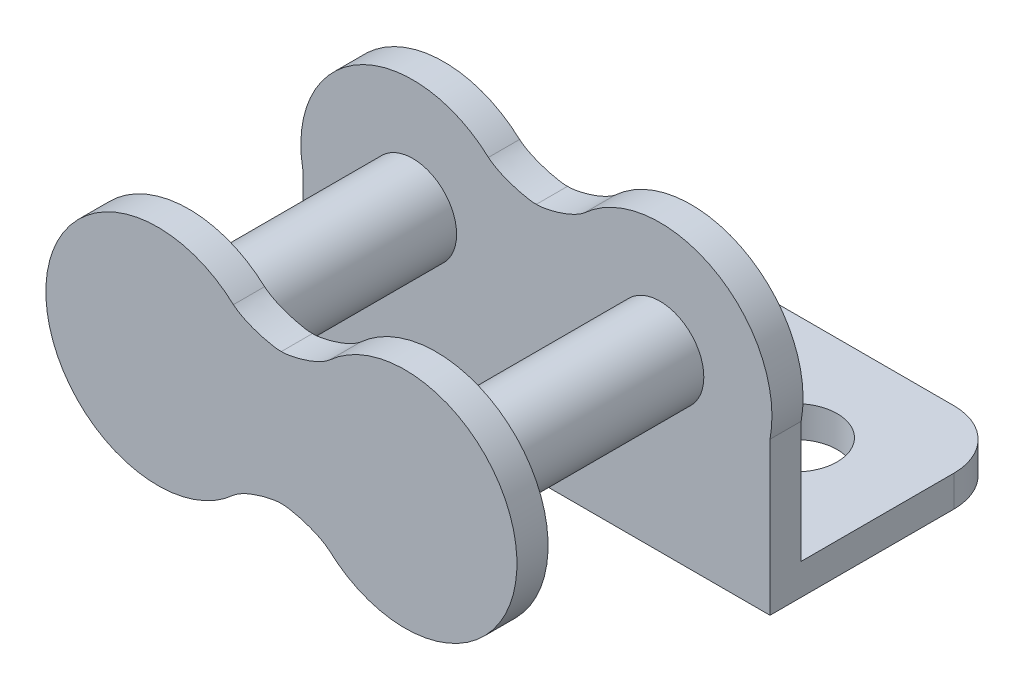
ISO-10303-21;
HEADER;
FILE_DESCRIPTION(('STEP AP214'),'2;1');
FILE_NAME('part.step','',(''),(''),'','','');
FILE_SCHEMA(('AUTOMOTIVE_DESIGN { 1 0 10303 214 1 1 1 1 }'));
ENDSEC;
DATA;
#1=APPLICATION_CONTEXT('core data for automotive mechanical design processes');
#2=APPLICATION_PROTOCOL_DEFINITION('international standard','automotive_design',2000,#1);
#3=PRODUCT_CONTEXT('',#1,'mechanical');
#4=PRODUCT('Part','Part','',(#3));
#5=PRODUCT_RELATED_PRODUCT_CATEGORY('part','',(#4));
#6=PRODUCT_DEFINITION_FORMATION('','',#4);
#7=PRODUCT_DEFINITION_CONTEXT('part definition',#1,'design');
#8=PRODUCT_DEFINITION('design','',#6,#7);
#9=PRODUCT_DEFINITION_SHAPE('','',#8);
#10=(LENGTH_UNIT() NAMED_UNIT(*) SI_UNIT(.MILLI.,.METRE.));
#11=(NAMED_UNIT(*) PLANE_ANGLE_UNIT() SI_UNIT($,.RADIAN.));
#12=(NAMED_UNIT(*) SI_UNIT($,.STERADIAN.) SOLID_ANGLE_UNIT());
#13=UNCERTAINTY_MEASURE_WITH_UNIT(LENGTH_MEASURE(1.E-05),#10,'distance_accuracy_value','');
#14=(GEOMETRIC_REPRESENTATION_CONTEXT(3) GLOBAL_UNCERTAINTY_ASSIGNED_CONTEXT((#13)) GLOBAL_UNIT_ASSIGNED_CONTEXT((#10,
#11,#12)) REPRESENTATION_CONTEXT('',''));
#15=CARTESIAN_POINT('',(0.,0.,0.));
#16=DIRECTION('',(0.,0.,1.));
#17=DIRECTION('',(1.,0.,0.));
#18=AXIS2_PLACEMENT_3D('',#15,#16,#17);
#19=CARTESIAN_POINT('',(0.,0.,4.45));
#20=DIRECTION('',(0.,0.,1.));
#21=DIRECTION('',(1.,0.,0.));
#22=AXIS2_PLACEMENT_3D('',#19,#20,#21);
#23=PLANE('',#22);
#24=CARTESIAN_POINT('',(-6.34999999999999,0.,4.45));
#25=DIRECTION('',(0.,0.,1.));
#26=DIRECTION('',(1.,0.,0.));
#27=AXIS2_PLACEMENT_3D('',#24,#25,#26);
#28=CIRCLE('',#27,5.75);
#29=CARTESIAN_POINT('',(-2.46452218888914,4.23858020796649,4.45));
#30=VERTEX_POINT('',#29);
#31=CARTESIAN_POINT('',(-2.46452218888914,-4.23858020796649,4.45));
#32=VERTEX_POINT('',#31);
#33=EDGE_CURVE('E259',#30,#32,#28,.T.);
#34=ORIENTED_EDGE('',*,*,#33,.F.);
#35=CARTESIAN_POINT('',(-2.46452218888914,4.23858020796649,4.45));
#36=CARTESIAN_POINT('',(-1.80114730329289,3.67793909032685,4.45));
#37=CARTESIAN_POINT('',(-0.37079064444816,3.34588107002075,4.45));
#38=CARTESIAN_POINT('',(0.,3.3863509377361,4.45));
#39=B_SPLINE_CURVE_WITH_KNOTS('',3,(#35,#36,#37,#38),.UNSPECIFIED.,.F.,.F.,(4,4),(0.,1.),.UNSPECIFIED.);
#40=CARTESIAN_POINT('',(0.,3.3863509377361,4.45));
#41=VERTEX_POINT('',#40);
#42=EDGE_CURVE('E290',#30,#41,#39,.T.);
#43=ORIENTED_EDGE('',*,*,#42,.T.);
#44=CARTESIAN_POINT('',(2.46452218888914,4.23858020796649,4.45));
#45=CARTESIAN_POINT('',(1.80114730329289,3.67793909032685,4.45));
#46=CARTESIAN_POINT('',(0.37079064444816,3.34588107002075,4.45));
#47=CARTESIAN_POINT('',(0.,3.3863509377361,4.45));
#48=B_SPLINE_CURVE_WITH_KNOTS('',3,(#44,#45,#46,#47),.UNSPECIFIED.,.F.,.F.,(4,4),(0.,1.),.UNSPECIFIED.);
#49=CARTESIAN_POINT('',(2.46452218888915,4.23858020796648,4.45));
#50=VERTEX_POINT('',#49);
#51=EDGE_CURVE('E285',#50,#41,#48,.T.);
#52=ORIENTED_EDGE('',*,*,#51,.F.);
#53=CARTESIAN_POINT('',(6.35,0.,4.45));
#54=DIRECTION('',(0.,0.,1.));
#55=DIRECTION('',(1.,0.,0.));
#56=AXIS2_PLACEMENT_3D('',#53,#54,#55);
#57=CIRCLE('',#56,5.75);
#58=CARTESIAN_POINT('',(2.46452218888915,-4.23858020796648,4.45));
#59=VERTEX_POINT('',#58);
#60=EDGE_CURVE('E279',#50,#59,#57,.F.);
#61=ORIENTED_EDGE('',*,*,#60,.T.);
#62=CARTESIAN_POINT('',(2.46452218888914,-4.23858020796649,4.45));
#63=CARTESIAN_POINT('',(1.8011473032929,-3.67793909032685,4.45));
#64=CARTESIAN_POINT('',(0.37079064444816,-3.34588107002075,4.45));
#65=CARTESIAN_POINT('',(0.,-3.3863509377361,4.45));
#66=B_SPLINE_CURVE_WITH_KNOTS('',3,(#62,#63,#64,#65),.UNSPECIFIED.,.F.,.F.,(4,4),(0.,1.),.UNSPECIFIED.);
#67=CARTESIAN_POINT('',(0.,-3.3863509377361,4.45));
#68=VERTEX_POINT('',#67);
#69=EDGE_CURVE('E271',#59,#68,#66,.T.);
#70=ORIENTED_EDGE('',*,*,#69,.T.);
#71=CARTESIAN_POINT('',(-2.46452218888914,-4.23858020796649,4.45));
#72=CARTESIAN_POINT('',(-1.80114730329289,-3.67793909032685,4.45));
#73=CARTESIAN_POINT('',(-0.37079064444816,-3.34588107002075,4.45));
#74=CARTESIAN_POINT('',(0.,-3.3863509377361,4.45));
#75=B_SPLINE_CURVE_WITH_KNOTS('',3,(#71,#72,#73,#74),.UNSPECIFIED.,.F.,.F.,(4,4),(0.,1.),.UNSPECIFIED.);
#76=EDGE_CURVE('E265',#32,#68,#75,.T.);
#77=ORIENTED_EDGE('',*,*,#76,.F.);
#78=EDGE_LOOP('',(#34,#43,#52,#61,#70,#77));
#79=FACE_BOUND('',#78,.T.);
#80=CARTESIAN_POINT('',(6.35000000000001,0.,4.45));
#81=DIRECTION('',(0.,0.,1.));
#82=DIRECTION('',(1.,0.,0.));
#83=AXIS2_PLACEMENT_3D('',#80,#81,#82);
#84=CIRCLE('',#83,2.25);
#85=CARTESIAN_POINT('',(8.60000000000001,0.,4.45));
#86=VERTEX_POINT('',#85);
#87=EDGE_CURVE('E365',#86,#86,#84,.T.);
#88=ORIENTED_EDGE('',*,*,#87,.T.);
#89=EDGE_LOOP('',(#88));
#90=FACE_BOUND('',#89,.T.);
#91=CARTESIAN_POINT('',(-6.34999999999999,0.,4.45));
#92=DIRECTION('',(0.,0.,1.));
#93=DIRECTION('',(1.,0.,0.));
#94=AXIS2_PLACEMENT_3D('',#91,#92,#93);
#95=CIRCLE('',#94,2.25);
#96=CARTESIAN_POINT('',(-4.09999999999999,0.,4.45));
#97=VERTEX_POINT('',#96);
#98=EDGE_CURVE('E266',#97,#97,#95,.T.);
#99=ORIENTED_EDGE('',*,*,#98,.T.);
#100=EDGE_LOOP('',(#99));
#101=FACE_BOUND('',#100,.T.);
#102=ADVANCED_FACE('F38',(#79,#90,#101),#23,.F.);
#103=CARTESIAN_POINT('',(-6.34999999999999,0.,6.05));
#104=DIRECTION('',(0.,0.,-1.));
#105=DIRECTION('',(-1.,0.,0.));
#106=AXIS2_PLACEMENT_3D('',#103,#104,#105);
#107=CYLINDRICAL_SURFACE('',#106,5.75);
#108=ORIENTED_EDGE('',*,*,#33,.T.);
#109=DIRECTION('',(0.,0.,-1.));
#110=VECTOR('',#109,1.);
#111=CARTESIAN_POINT('',(-2.46452218888914,-4.23858020796649,6.05));
#112=LINE('',#111,#110);
#113=CARTESIAN_POINT('',(-2.46452218888914,-4.23858020796649,6.05));
#114=VERTEX_POINT('',#113);
#115=EDGE_CURVE('E311',#114,#32,#112,.T.);
#116=ORIENTED_EDGE('',*,*,#115,.F.);
#117=CARTESIAN_POINT('',(-6.34999999999999,0.,6.05));
#118=DIRECTION('',(0.,0.,1.));
#119=DIRECTION('',(1.,0.,0.));
#120=AXIS2_PLACEMENT_3D('',#117,#118,#119);
#121=CIRCLE('',#120,5.75);
#122=CARTESIAN_POINT('',(-2.46452218888914,4.23858020796649,6.05));
#123=VERTEX_POINT('',#122);
#124=EDGE_CURVE('E298',#123,#114,#121,.T.);
#125=ORIENTED_EDGE('',*,*,#124,.F.);
#126=DIRECTION('',(0.,0.,-1.));
#127=VECTOR('',#126,1.);
#128=CARTESIAN_POINT('',(-2.46452218888914,4.23858020796649,6.05));
#129=LINE('',#128,#127);
#130=EDGE_CURVE('E253',#123,#30,#129,.T.);
#131=ORIENTED_EDGE('',*,*,#130,.T.);
#132=EDGE_LOOP('',(#108,#116,#125,#131));
#133=FACE_BOUND('',#132,.T.);
#134=ADVANCED_FACE('F238',(#133),#107,.T.);
#135=CARTESIAN_POINT('',(-2.46452218888914,-4.23858020796649,6.05));
#136=CARTESIAN_POINT('',(-1.80114730329289,-3.67793909032685,6.05));
#137=CARTESIAN_POINT('',(-0.37079064444816,-3.34588107002075,6.05));
#138=CARTESIAN_POINT('',(0.,-3.3863509377361,6.05));
#139=B_SPLINE_CURVE_WITH_KNOTS('',3,(#135,#136,#137,#138),.UNSPECIFIED.,.F.,.F.,(4,4),(0.,1.),.UNSPECIFIED.);
#140=DIRECTION('',(0.,0.,-1.));
#141=VECTOR('',#140,1.);
#142=SURFACE_OF_LINEAR_EXTRUSION('',#139,#141);
#143=ORIENTED_EDGE('',*,*,#76,.T.);
#144=DIRECTION('',(0.,0.,-1.));
#145=VECTOR('',#144,1.);
#146=CARTESIAN_POINT('',(0.,-3.3863509377361,6.05));
#147=LINE('',#146,#145);
#148=CARTESIAN_POINT('',(0.,-3.3863509377361,6.05));
#149=VERTEX_POINT('',#148);
#150=EDGE_CURVE('E309',#149,#68,#147,.T.);
#151=ORIENTED_EDGE('',*,*,#150,.F.);
#152=EDGE_CURVE('E374',#114,#149,#139,.T.);
#153=ORIENTED_EDGE('',*,*,#152,.F.);
#154=ORIENTED_EDGE('',*,*,#115,.T.);
#155=EDGE_LOOP('',(#143,#151,#153,#154));
#156=FACE_BOUND('',#155,.T.);
#157=ADVANCED_FACE('F387',(#156),#142,.F.);
#158=CARTESIAN_POINT('',(2.46452218888914,-4.23858020796649,6.05));
#159=CARTESIAN_POINT('',(1.8011473032929,-3.67793909032685,6.05));
#160=CARTESIAN_POINT('',(0.37079064444816,-3.34588107002075,6.05));
#161=CARTESIAN_POINT('',(0.,-3.3863509377361,6.05));
#162=B_SPLINE_CURVE_WITH_KNOTS('',3,(#158,#159,#160,#161),.UNSPECIFIED.,.F.,.F.,(4,4),(0.,1.),.UNSPECIFIED.);
#163=DIRECTION('',(0.,0.,-1.));
#164=VECTOR('',#163,1.);
#165=SURFACE_OF_LINEAR_EXTRUSION('',#162,#164);
#166=ORIENTED_EDGE('',*,*,#69,.F.);
#167=DIRECTION('',(0.,0.,-1.));
#168=VECTOR('',#167,1.);
#169=CARTESIAN_POINT('',(2.46452218888915,-4.23858020796648,6.05));
#170=LINE('',#169,#168);
#171=CARTESIAN_POINT('',(2.46452218888915,-4.23858020796648,6.05));
#172=VERTEX_POINT('',#171);
#173=EDGE_CURVE('E307',#172,#59,#170,.T.);
#174=ORIENTED_EDGE('',*,*,#173,.F.);
#175=EDGE_CURVE('E379',#172,#149,#162,.T.);
#176=ORIENTED_EDGE('',*,*,#175,.T.);
#177=ORIENTED_EDGE('',*,*,#150,.T.);
#178=EDGE_LOOP('',(#166,#174,#176,#177));
#179=FACE_BOUND('',#178,.T.);
#180=ADVANCED_FACE('F391',(#179),#165,.T.);
#181=CARTESIAN_POINT('',(6.35,0.,6.05));
#182=DIRECTION('',(0.,0.,-1.));
#183=DIRECTION('',(-1.,0.,0.));
#184=AXIS2_PLACEMENT_3D('',#181,#182,#183);
#185=CYLINDRICAL_SURFACE('',#184,5.75);
#186=ORIENTED_EDGE('',*,*,#60,.F.);
#187=DIRECTION('',(0.,0.,-1.));
#188=VECTOR('',#187,1.);
#189=CARTESIAN_POINT('',(2.46452218888915,4.23858020796648,6.05));
#190=LINE('',#189,#188);
#191=CARTESIAN_POINT('',(2.46452218888915,4.23858020796648,6.05));
#192=VERTEX_POINT('',#191);
#193=EDGE_CURVE('E305',#192,#50,#190,.T.);
#194=ORIENTED_EDGE('',*,*,#193,.F.);
#195=CARTESIAN_POINT('',(6.35,0.,6.05));
#196=DIRECTION('',(0.,0.,1.));
#197=DIRECTION('',(1.,0.,0.));
#198=AXIS2_PLACEMENT_3D('',#195,#196,#197);
#199=CIRCLE('',#198,5.75);
#200=EDGE_CURVE('E687',#192,#172,#199,.F.);
#201=ORIENTED_EDGE('',*,*,#200,.T.);
#202=ORIENTED_EDGE('',*,*,#173,.T.);
#203=EDGE_LOOP('',(#186,#194,#201,#202));
#204=FACE_BOUND('',#203,.T.);
#205=ADVANCED_FACE('F509',(#204),#185,.T.);
#206=CARTESIAN_POINT('',(2.46452218888914,4.23858020796649,6.05));
#207=CARTESIAN_POINT('',(1.80114730329289,3.67793909032685,6.05));
#208=CARTESIAN_POINT('',(0.37079064444816,3.34588107002075,6.05));
#209=CARTESIAN_POINT('',(0.,3.3863509377361,6.05));
#210=B_SPLINE_CURVE_WITH_KNOTS('',3,(#206,#207,#208,#209),.UNSPECIFIED.,.F.,.F.,(4,4),(0.,1.),.UNSPECIFIED.);
#211=DIRECTION('',(0.,0.,-1.));
#212=VECTOR('',#211,1.);
#213=SURFACE_OF_LINEAR_EXTRUSION('',#210,#212);
#214=ORIENTED_EDGE('',*,*,#51,.T.);
#215=DIRECTION('',(0.,0.,-1.));
#216=VECTOR('',#215,1.);
#217=CARTESIAN_POINT('',(0.,3.3863509377361,6.05));
#218=LINE('',#217,#216);
#219=CARTESIAN_POINT('',(0.,3.3863509377361,6.05));
#220=VERTEX_POINT('',#219);
#221=EDGE_CURVE('E303',#220,#41,#218,.T.);
#222=ORIENTED_EDGE('',*,*,#221,.F.);
#223=EDGE_CURVE('E254',#192,#220,#210,.T.);
#224=ORIENTED_EDGE('',*,*,#223,.F.);
#225=ORIENTED_EDGE('',*,*,#193,.T.);
#226=EDGE_LOOP('',(#214,#222,#224,#225));
#227=FACE_BOUND('',#226,.T.);
#228=ADVANCED_FACE('F243',(#227),#213,.F.);
#229=CARTESIAN_POINT('',(-2.46452218888914,4.23858020796649,6.05));
#230=CARTESIAN_POINT('',(-1.80114730329289,3.67793909032685,6.05));
#231=CARTESIAN_POINT('',(-0.37079064444816,3.34588107002075,6.05));
#232=CARTESIAN_POINT('',(0.,3.3863509377361,6.05));
#233=B_SPLINE_CURVE_WITH_KNOTS('',3,(#229,#230,#231,#232),.UNSPECIFIED.,.F.,.F.,(4,4),(0.,1.),.UNSPECIFIED.);
#234=DIRECTION('',(0.,0.,-1.));
#235=VECTOR('',#234,1.);
#236=SURFACE_OF_LINEAR_EXTRUSION('',#233,#235);
#237=ORIENTED_EDGE('',*,*,#42,.F.);
#238=ORIENTED_EDGE('',*,*,#130,.F.);
#239=EDGE_CURVE('E247',#123,#220,#233,.T.);
#240=ORIENTED_EDGE('',*,*,#239,.T.);
#241=ORIENTED_EDGE('',*,*,#221,.T.);
#242=EDGE_LOOP('',(#237,#238,#240,#241));
#243=FACE_BOUND('',#242,.T.);
#244=ADVANCED_FACE('F234',(#243),#236,.T.);
#245=CARTESIAN_POINT('',(0.,0.,6.05));
#246=DIRECTION('',(0.,0.,1.));
#247=DIRECTION('',(1.,0.,0.));
#248=AXIS2_PLACEMENT_3D('',#245,#246,#247);
#249=PLANE('',#248);
#250=ORIENTED_EDGE('',*,*,#124,.T.);
#251=ORIENTED_EDGE('',*,*,#152,.T.);
#252=ORIENTED_EDGE('',*,*,#175,.F.);
#253=ORIENTED_EDGE('',*,*,#200,.F.);
#254=ORIENTED_EDGE('',*,*,#223,.T.);
#255=ORIENTED_EDGE('',*,*,#239,.F.);
#256=EDGE_LOOP('',(#250,#251,#252,#253,#254,#255));
#257=FACE_BOUND('',#256,.T.);
#258=ADVANCED_FACE('F230',(#257),#249,.T.);
#259=CARTESIAN_POINT('',(-6.34999999999999,0.,-7.05));
#260=DIRECTION('',(0.,0.,1.));
#261=DIRECTION('',(1.,0.,0.));
#262=AXIS2_PLACEMENT_3D('',#259,#260,#261);
#263=CYLINDRICAL_SURFACE('',#262,2.25);
#264=CARTESIAN_POINT('',(-6.34999999999999,0.,-7.05));
#265=DIRECTION('',(0.,0.,1.));
#266=DIRECTION('',(1.,0.,0.));
#267=AXIS2_PLACEMENT_3D('',#264,#265,#266);
#268=CIRCLE('',#267,2.25);
#269=CARTESIAN_POINT('',(-4.09999999999999,0.,-7.05));
#270=VERTEX_POINT('',#269);
#271=EDGE_CURVE('E364',#270,#270,#268,.T.);
#272=ORIENTED_EDGE('',*,*,#271,.T.);
#273=EDGE_LOOP('',(#272));
#274=FACE_BOUND('',#273,.T.);
#275=ORIENTED_EDGE('',*,*,#98,.F.);
#276=EDGE_LOOP('',(#275));
#277=FACE_BOUND('',#276,.T.);
#278=ADVANCED_FACE('F226',(#274,#277),#263,.T.);
#279=CARTESIAN_POINT('',(6.35000000000001,0.,-7.05));
#280=DIRECTION('',(0.,0.,1.));
#281=DIRECTION('',(1.,0.,0.));
#282=AXIS2_PLACEMENT_3D('',#279,#280,#281);
#283=CYLINDRICAL_SURFACE('',#282,2.25);
#284=CARTESIAN_POINT('',(6.35000000000001,0.,-7.05));
#285=DIRECTION('',(0.,0.,1.));
#286=DIRECTION('',(1.,0.,0.));
#287=AXIS2_PLACEMENT_3D('',#284,#285,#286);
#288=CIRCLE('',#287,2.25);
#289=CARTESIAN_POINT('',(8.60000000000001,0.,-7.05));
#290=VERTEX_POINT('',#289);
#291=EDGE_CURVE('E361',#290,#290,#288,.T.);
#292=ORIENTED_EDGE('',*,*,#291,.T.);
#293=EDGE_LOOP('',(#292));
#294=FACE_BOUND('',#293,.T.);
#295=ORIENTED_EDGE('',*,*,#87,.F.);
#296=EDGE_LOOP('',(#295));
#297=FACE_BOUND('',#296,.T.);
#298=ADVANCED_FACE('F222',(#294,#297),#283,.T.);
#299=CARTESIAN_POINT('',(-12.,0.,-8.65));
#300=DIRECTION('',(-1.,0.,0.));
#301=DIRECTION('',(0.,-1.,0.));
#302=AXIS2_PLACEMENT_3D('',#299,#300,#301);
#303=PLANE('',#302);
#304=DIRECTION('',(0.,0.,1.));
#305=VECTOR('',#304,1.);
#306=CARTESIAN_POINT('',(-12.,-7.3,-19.5));
#307=LINE('',#306,#305);
#308=CARTESIAN_POINT('',(-12.,-7.3,-16.5));
#309=VERTEX_POINT('',#308);
#310=CARTESIAN_POINT('',(-12.,-7.3,-8.65));
#311=VERTEX_POINT('',#310);
#312=EDGE_CURVE('E162',#309,#311,#307,.T.);
#313=ORIENTED_EDGE('',*,*,#312,.F.);
#314=DIRECTION('',(0.,1.,0.));
#315=VECTOR('',#314,1.);
#316=CARTESIAN_POINT('',(-12.,0.,-16.5));
#317=LINE('',#316,#315);
#318=CARTESIAN_POINT('',(-12.,-8.9,-16.5));
#319=VERTEX_POINT('',#318);
#320=EDGE_CURVE('E11',#309,#319,#317,.F.);
#321=ORIENTED_EDGE('',*,*,#320,.T.);
#322=DIRECTION('',(0.,0.,1.));
#323=VECTOR('',#322,1.);
#324=CARTESIAN_POINT('',(-12.,-8.9,-8.65));
#325=LINE('',#324,#323);
#326=CARTESIAN_POINT('',(-12.,-8.9,-7.05));
#327=VERTEX_POINT('',#326);
#328=EDGE_CURVE('E174',#319,#327,#325,.T.);
#329=ORIENTED_EDGE('',*,*,#328,.T.);
#330=DIRECTION('',(0.,-1.,0.));
#331=VECTOR('',#330,1.);
#332=CARTESIAN_POINT('',(-12.,0.,-7.05));
#333=LINE('',#332,#331);
#334=CARTESIAN_POINT('',(-12.,-1.06770782520312,-7.05));
#335=VERTEX_POINT('',#334);
#336=EDGE_CURVE('E188',#335,#327,#333,.T.);
#337=ORIENTED_EDGE('',*,*,#336,.F.);
#338=DIRECTION('',(0.,0.,1.));
#339=VECTOR('',#338,1.);
#340=CARTESIAN_POINT('',(-12.,-1.06770782520312,-8.65));
#341=LINE('',#340,#339);
#342=CARTESIAN_POINT('',(-12.,-1.06770782520312,-8.65));
#343=VERTEX_POINT('',#342);
#344=EDGE_CURVE('E359',#343,#335,#341,.T.);
#345=ORIENTED_EDGE('',*,*,#344,.F.);
#346=DIRECTION('',(0.,-1.,0.));
#347=VECTOR('',#346,1.);
#348=CARTESIAN_POINT('',(-12.,0.,-8.65));
#349=LINE('',#348,#347);
#350=EDGE_CURVE('E189',#343,#311,#349,.T.);
#351=ORIENTED_EDGE('',*,*,#350,.T.);
#352=EDGE_LOOP('',(#313,#321,#329,#337,#345,#351));
#353=FACE_BOUND('',#352,.T.);
#354=ADVANCED_FACE('F218',(#353),#303,.T.);
#355=CARTESIAN_POINT('',(-6.34999999999999,0.,-8.65));
#356=DIRECTION('',(0.,0.,1.));
#357=DIRECTION('',(1.,0.,0.));
#358=AXIS2_PLACEMENT_3D('',#355,#356,#357);
#359=CYLINDRICAL_SURFACE('',#358,5.75);
#360=CARTESIAN_POINT('',(-6.34999999999999,0.,-7.05));
#361=DIRECTION('',(0.,0.,-1.));
#362=DIRECTION('',(-1.,0.,0.));
#363=AXIS2_PLACEMENT_3D('',#360,#361,#362);
#364=CIRCLE('',#363,5.75);
#365=CARTESIAN_POINT('',(-2.46452218888914,4.23858020796648,-7.05));
#366=VERTEX_POINT('',#365);
#367=EDGE_CURVE('E455',#335,#366,#364,.T.);
#368=ORIENTED_EDGE('',*,*,#367,.T.);
#369=DIRECTION('',(0.,0.,1.));
#370=VECTOR('',#369,1.);
#371=CARTESIAN_POINT('',(-2.46452218888914,4.23858020796648,-8.65));
#372=LINE('',#371,#370);
#373=CARTESIAN_POINT('',(-2.46452218888914,4.23858020796648,-8.65));
#374=VERTEX_POINT('',#373);
#375=EDGE_CURVE('E356',#374,#366,#372,.T.);
#376=ORIENTED_EDGE('',*,*,#375,.F.);
#377=CARTESIAN_POINT('',(-6.34999999999999,0.,-8.65));
#378=DIRECTION('',(0.,0.,-1.));
#379=DIRECTION('',(-1.,0.,0.));
#380=AXIS2_PLACEMENT_3D('',#377,#378,#379);
#381=CIRCLE('',#380,5.75);
#382=EDGE_CURVE('E191',#343,#374,#381,.T.);
#383=ORIENTED_EDGE('',*,*,#382,.F.);
#384=ORIENTED_EDGE('',*,*,#344,.T.);
#385=EDGE_LOOP('',(#368,#376,#383,#384));
#386=FACE_BOUND('',#385,.T.);
#387=ADVANCED_FACE('F213',(#386),#359,.T.);
#388=CARTESIAN_POINT('',(-2.46452218888914,4.23858020796649,-8.65));
#389=CARTESIAN_POINT('',(-1.80114730329289,3.67793909032685,-8.65));
#390=CARTESIAN_POINT('',(-0.37079064444816,3.34588107002075,-8.65));
#391=CARTESIAN_POINT('',(0.,3.3863509377361,-8.65));
#392=B_SPLINE_CURVE_WITH_KNOTS('',3,(#388,#389,#390,#391),.UNSPECIFIED.,.F.,.F.,(4,4),(0.,1.),.UNSPECIFIED.);
#393=DIRECTION('',(0.,0.,1.));
#394=VECTOR('',#393,1.);
#395=SURFACE_OF_LINEAR_EXTRUSION('',#392,#394);
#396=CARTESIAN_POINT('',(-2.46452218888914,4.23858020796649,-7.05));
#397=CARTESIAN_POINT('',(-1.80114730329289,3.67793909032685,-7.05));
#398=CARTESIAN_POINT('',(-0.37079064444816,3.34588107002075,-7.05));
#399=CARTESIAN_POINT('',(0.,3.3863509377361,-7.05));
#400=B_SPLINE_CURVE_WITH_KNOTS('',3,(#396,#397,#398,#399),.UNSPECIFIED.,.F.,.F.,(4,4),(0.,1.),.UNSPECIFIED.);
#401=CARTESIAN_POINT('',(0.,3.3863509377361,-7.05));
#402=VERTEX_POINT('',#401);
#403=EDGE_CURVE('E448',#366,#402,#400,.T.);
#404=ORIENTED_EDGE('',*,*,#403,.T.);
#405=DIRECTION('',(0.,0.,1.));
#406=VECTOR('',#405,1.);
#407=CARTESIAN_POINT('',(0.,3.3863509377361,-8.65));
#408=LINE('',#407,#406);
#409=CARTESIAN_POINT('',(0.,3.3863509377361,-8.65));
#410=VERTEX_POINT('',#409);
#411=EDGE_CURVE('E353',#410,#402,#408,.T.);
#412=ORIENTED_EDGE('',*,*,#411,.F.);
#413=EDGE_CURVE('E194',#374,#410,#392,.T.);
#414=ORIENTED_EDGE('',*,*,#413,.F.);
#415=ORIENTED_EDGE('',*,*,#375,.T.);
#416=EDGE_LOOP('',(#404,#412,#414,#415));
#417=FACE_BOUND('',#416,.T.);
#418=ADVANCED_FACE('F208',(#417),#395,.F.);
#419=CARTESIAN_POINT('',(0.,3.3863509377361,-8.65));
#420=CARTESIAN_POINT('',(0.37079064444816,3.34588107002075,-8.65));
#421=CARTESIAN_POINT('',(1.80114730329289,3.67793909032685,-8.65));
#422=CARTESIAN_POINT('',(2.46452218888914,4.23858020796649,-8.65));
#423=B_SPLINE_CURVE_WITH_KNOTS('',3,(#419,#420,#421,#422),.UNSPECIFIED.,.F.,.F.,(4,4),(0.,1.),.UNSPECIFIED.);
#424=DIRECTION('',(0.,0.,1.));
#425=VECTOR('',#424,1.);
#426=SURFACE_OF_LINEAR_EXTRUSION('',#423,#425);
#427=CARTESIAN_POINT('',(0.,3.3863509377361,-7.05));
#428=CARTESIAN_POINT('',(0.37079064444816,3.34588107002075,-7.05));
#429=CARTESIAN_POINT('',(1.80114730329289,3.67793909032685,-7.05));
#430=CARTESIAN_POINT('',(2.46452218888914,4.23858020796649,-7.05));
#431=B_SPLINE_CURVE_WITH_KNOTS('',3,(#427,#428,#429,#430),.UNSPECIFIED.,.F.,.F.,(4,4),(0.,1.),.UNSPECIFIED.);
#432=CARTESIAN_POINT('',(2.46452218888915,4.23858020796649,-7.05));
#433=VERTEX_POINT('',#432);
#434=EDGE_CURVE('E440',#402,#433,#431,.T.);
#435=ORIENTED_EDGE('',*,*,#434,.T.);
#436=DIRECTION('',(0.,0.,1.));
#437=VECTOR('',#436,1.);
#438=CARTESIAN_POINT('',(2.46452218888915,4.23858020796649,-8.65));
#439=LINE('',#438,#437);
#440=CARTESIAN_POINT('',(2.46452218888915,4.23858020796649,-8.65));
#441=VERTEX_POINT('',#440);
#442=EDGE_CURVE('E346',#441,#433,#439,.T.);
#443=ORIENTED_EDGE('',*,*,#442,.F.);
#444=EDGE_CURVE('E199',#410,#441,#423,.T.);
#445=ORIENTED_EDGE('',*,*,#444,.F.);
#446=ORIENTED_EDGE('',*,*,#411,.T.);
#447=EDGE_LOOP('',(#435,#443,#445,#446));
#448=FACE_BOUND('',#447,.T.);
#449=ADVANCED_FACE('F212',(#448),#426,.F.);
#450=CARTESIAN_POINT('',(6.35,0.,-8.65));
#451=DIRECTION('',(0.,0.,1.));
#452=DIRECTION('',(1.,0.,0.));
#453=AXIS2_PLACEMENT_3D('',#450,#451,#452);
#454=CYLINDRICAL_SURFACE('',#453,5.75);
#455=CARTESIAN_POINT('',(6.35,0.,-7.05));
#456=DIRECTION('',(0.,0.,-1.));
#457=DIRECTION('',(-1.,0.,0.));
#458=AXIS2_PLACEMENT_3D('',#455,#456,#457);
#459=CIRCLE('',#458,5.75);
#460=CARTESIAN_POINT('',(12.,-1.06770782520312,-7.05));
#461=VERTEX_POINT('',#460);
#462=EDGE_CURVE('E436',#433,#461,#459,.T.);
#463=ORIENTED_EDGE('',*,*,#462,.T.);
#464=DIRECTION('',(0.,0.,1.));
#465=VECTOR('',#464,1.);
#466=CARTESIAN_POINT('',(12.,-1.06770782520312,-8.65));
#467=LINE('',#466,#465);
#468=CARTESIAN_POINT('',(12.,-1.06770782520312,-8.65));
#469=VERTEX_POINT('',#468);
#470=EDGE_CURVE('E344',#469,#461,#467,.T.);
#471=ORIENTED_EDGE('',*,*,#470,.F.);
#472=CARTESIAN_POINT('',(6.35,0.,-8.65));
#473=DIRECTION('',(0.,0.,-1.));
#474=DIRECTION('',(-1.,0.,0.));
#475=AXIS2_PLACEMENT_3D('',#472,#473,#474);
#476=CIRCLE('',#475,5.75);
#477=EDGE_CURVE('E172',#441,#469,#476,.T.);
#478=ORIENTED_EDGE('',*,*,#477,.F.);
#479=ORIENTED_EDGE('',*,*,#442,.T.);
#480=EDGE_LOOP('',(#463,#471,#478,#479));
#481=FACE_BOUND('',#480,.T.);
#482=ADVANCED_FACE('F428',(#481),#454,.T.);
#483=CARTESIAN_POINT('',(12.,0.,-8.65));
#484=DIRECTION('',(-1.,0.,0.));
#485=DIRECTION('',(0.,-1.,0.));
#486=AXIS2_PLACEMENT_3D('',#483,#484,#485);
#487=PLANE('',#486);
#488=DIRECTION('',(0.,0.,1.));
#489=VECTOR('',#488,1.);
#490=CARTESIAN_POINT('',(12.,-8.9,-8.65));
#491=LINE('',#490,#489);
#492=CARTESIAN_POINT('',(12.,-8.9,-16.5));
#493=VERTEX_POINT('',#492);
#494=CARTESIAN_POINT('',(12.,-8.9,-7.05));
#495=VERTEX_POINT('',#494);
#496=EDGE_CURVE('E339',#493,#495,#491,.T.);
#497=ORIENTED_EDGE('',*,*,#496,.F.);
#498=DIRECTION('',(0.,-1.,0.));
#499=VECTOR('',#498,1.);
#500=CARTESIAN_POINT('',(12.,-7.3,-16.5));
#501=LINE('',#500,#499);
#502=CARTESIAN_POINT('',(12.,-7.3,-16.5));
#503=VERTEX_POINT('',#502);
#504=EDGE_CURVE('E61',#493,#503,#501,.F.);
#505=ORIENTED_EDGE('',*,*,#504,.T.);
#506=DIRECTION('',(0.,0.,1.));
#507=VECTOR('',#506,1.);
#508=CARTESIAN_POINT('',(12.,-7.3,-19.5));
#509=LINE('',#508,#507);
#510=CARTESIAN_POINT('',(12.,-7.3,-8.65));
#511=VERTEX_POINT('',#510);
#512=EDGE_CURVE('E155',#503,#511,#509,.T.);
#513=ORIENTED_EDGE('',*,*,#512,.T.);
#514=DIRECTION('',(0.,-1.,0.));
#515=VECTOR('',#514,1.);
#516=CARTESIAN_POINT('',(12.,0.,-8.65));
#517=LINE('',#516,#515);
#518=EDGE_CURVE('E159',#469,#511,#517,.T.);
#519=ORIENTED_EDGE('',*,*,#518,.F.);
#520=ORIENTED_EDGE('',*,*,#470,.T.);
#521=DIRECTION('',(0.,-1.,0.));
#522=VECTOR('',#521,1.);
#523=CARTESIAN_POINT('',(12.,0.,-7.05));
#524=LINE('',#523,#522);
#525=EDGE_CURVE('E342',#461,#495,#524,.T.);
#526=ORIENTED_EDGE('',*,*,#525,.T.);
#527=EDGE_LOOP('',(#497,#505,#513,#519,#520,#526));
#528=FACE_BOUND('',#527,.T.);
#529=ADVANCED_FACE('F157',(#528),#487,.F.);
#530=CARTESIAN_POINT('',(0.,-8.9,-8.65));
#531=DIRECTION('',(0.,1.,0.));
#532=DIRECTION('',(0.,0.,1.));
#533=AXIS2_PLACEMENT_3D('',#530,#531,#532);
#534=PLANE('',#533);
#535=CARTESIAN_POINT('',(-6.35,-8.9,-14.));
#536=DIRECTION('',(0.,-1.,0.));
#537=DIRECTION('',(0.,0.,-1.));
#538=AXIS2_PLACEMENT_3D('',#535,#536,#537);
#539=CIRCLE('',#538,2.15);
#540=CARTESIAN_POINT('',(-6.35,-8.9,-16.15));
#541=VERTEX_POINT('',#540);
#542=EDGE_CURVE('E316',#541,#541,#539,.T.);
#543=ORIENTED_EDGE('',*,*,#542,.F.);
#544=EDGE_LOOP('',(#543));
#545=FACE_BOUND('',#544,.T.);
#546=CARTESIAN_POINT('',(6.35,-8.9,-14.));
#547=DIRECTION('',(0.,-1.,0.));
#548=DIRECTION('',(0.,0.,1.));
#549=AXIS2_PLACEMENT_3D('',#546,#547,#548);
#550=CIRCLE('',#549,2.15);
#551=CARTESIAN_POINT('',(6.35,-8.9,-11.85));
#552=VERTEX_POINT('',#551);
#553=EDGE_CURVE('E702',#552,#552,#550,.T.);
#554=ORIENTED_EDGE('',*,*,#553,.F.);
#555=EDGE_LOOP('',(#554));
#556=FACE_BOUND('',#555,.T.);
#557=DIRECTION('',(-1.,0.,0.));
#558=VECTOR('',#557,1.);
#559=CARTESIAN_POINT('',(-12.,-8.9,-19.5));
#560=LINE('',#559,#558);
#561=CARTESIAN_POINT('',(9.,-8.90000000000001,-19.5));
#562=VERTEX_POINT('',#561);
#563=CARTESIAN_POINT('',(-9.,-8.9,-19.5));
#564=VERTEX_POINT('',#563);
#565=EDGE_CURVE('E163',#562,#564,#560,.T.);
#566=ORIENTED_EDGE('',*,*,#565,.F.);
#567=CARTESIAN_POINT('',(9.,-8.9,-16.5));
#568=DIRECTION('',(0.,1.,0.));
#569=DIRECTION('',(0.,0.,1.));
#570=AXIS2_PLACEMENT_3D('',#567,#568,#569);
#571=CIRCLE('',#570,3.);
#572=EDGE_CURVE('E325',#562,#493,#571,.F.);
#573=ORIENTED_EDGE('',*,*,#572,.T.);
#574=ORIENTED_EDGE('',*,*,#496,.T.);
#575=DIRECTION('',(-1.,0.,0.));
#576=VECTOR('',#575,1.);
#577=CARTESIAN_POINT('',(0.,-8.9,-7.05));
#578=LINE('',#577,#576);
#579=EDGE_CURVE('E192',#495,#327,#578,.T.);
#580=ORIENTED_EDGE('',*,*,#579,.T.);
#581=ORIENTED_EDGE('',*,*,#328,.F.);
#582=CARTESIAN_POINT('',(-9.,-8.9,-16.5));
#583=DIRECTION('',(0.,1.,0.));
#584=DIRECTION('',(0.,0.,1.));
#585=AXIS2_PLACEMENT_3D('',#582,#583,#584);
#586=CIRCLE('',#585,3.);
#587=EDGE_CURVE('E323',#319,#564,#586,.F.);
#588=ORIENTED_EDGE('',*,*,#587,.T.);
#589=EDGE_LOOP('',(#566,#573,#574,#580,#581,#588));
#590=FACE_BOUND('',#589,.T.);
#591=ADVANCED_FACE('F337',(#545,#556,#590),#534,.F.);
#592=CARTESIAN_POINT('',(0.,0.,-8.65));
#593=DIRECTION('',(0.,0.,-1.));
#594=DIRECTION('',(-1.,0.,0.));
#595=AXIS2_PLACEMENT_3D('',#592,#593,#594);
#596=PLANE('',#595);
#597=DIRECTION('',(1.,0.,0.));
#598=VECTOR('',#597,1.);
#599=CARTESIAN_POINT('',(-12.,-7.3,-8.65));
#600=LINE('',#599,#598);
#601=EDGE_CURVE('E169',#311,#511,#600,.T.);
#602=ORIENTED_EDGE('',*,*,#601,.F.);
#603=ORIENTED_EDGE('',*,*,#350,.F.);
#604=ORIENTED_EDGE('',*,*,#382,.T.);
#605=ORIENTED_EDGE('',*,*,#413,.T.);
#606=ORIENTED_EDGE('',*,*,#444,.T.);
#607=ORIENTED_EDGE('',*,*,#477,.T.);
#608=ORIENTED_EDGE('',*,*,#518,.T.);
#609=EDGE_LOOP('',(#602,#603,#604,#605,#606,#607,#608));
#610=FACE_BOUND('',#609,.T.);
#611=ADVANCED_FACE('F167',(#610),#596,.T.);
#612=CARTESIAN_POINT('',(0.,0.,-7.05));
#613=DIRECTION('',(0.,0.,-1.));
#614=DIRECTION('',(-1.,0.,0.));
#615=AXIS2_PLACEMENT_3D('',#612,#613,#614);
#616=PLANE('',#615);
#617=ORIENTED_EDGE('',*,*,#271,.F.);
#618=EDGE_LOOP('',(#617));
#619=FACE_BOUND('',#618,.T.);
#620=ORIENTED_EDGE('',*,*,#291,.F.);
#621=EDGE_LOOP('',(#620));
#622=FACE_BOUND('',#621,.T.);
#623=ORIENTED_EDGE('',*,*,#336,.T.);
#624=ORIENTED_EDGE('',*,*,#579,.F.);
#625=ORIENTED_EDGE('',*,*,#525,.F.);
#626=ORIENTED_EDGE('',*,*,#462,.F.);
#627=ORIENTED_EDGE('',*,*,#434,.F.);
#628=ORIENTED_EDGE('',*,*,#403,.F.);
#629=ORIENTED_EDGE('',*,*,#367,.F.);
#630=EDGE_LOOP('',(#623,#624,#625,#626,#627,#628,#629));
#631=FACE_BOUND('',#630,.T.);
#632=ADVANCED_FACE('F417',(#619,#622,#631),#616,.F.);
#633=CARTESIAN_POINT('',(-12.,-7.3,-19.5));
#634=DIRECTION('',(0.,-1.,0.));
#635=DIRECTION('',(1.,0.,0.));
#636=AXIS2_PLACEMENT_3D('',#633,#634,#635);
#637=PLANE('',#636);
#638=CARTESIAN_POINT('',(-6.35,-7.3,-14.));
#639=DIRECTION('',(0.,-1.,0.));
#640=DIRECTION('',(1.,0.,0.));
#641=AXIS2_PLACEMENT_3D('',#638,#639,#640);
#642=CIRCLE('',#641,2.15);
#643=CARTESIAN_POINT('',(-4.2,-7.3,-14.));
#644=VERTEX_POINT('',#643);
#645=EDGE_CURVE('E178',#644,#644,#642,.T.);
#646=ORIENTED_EDGE('',*,*,#645,.T.);
#647=EDGE_LOOP('',(#646));
#648=FACE_BOUND('',#647,.T.);
#649=CARTESIAN_POINT('',(6.35,-7.3,-14.));
#650=DIRECTION('',(0.,-1.,0.));
#651=DIRECTION('',(1.,0.,0.));
#652=AXIS2_PLACEMENT_3D('',#649,#650,#651);
#653=CIRCLE('',#652,2.15);
#654=CARTESIAN_POINT('',(8.5,-7.3,-14.));
#655=VERTEX_POINT('',#654);
#656=EDGE_CURVE('E183',#655,#655,#653,.T.);
#657=ORIENTED_EDGE('',*,*,#656,.T.);
#658=EDGE_LOOP('',(#657));
#659=FACE_BOUND('',#658,.T.);
#660=ORIENTED_EDGE('',*,*,#512,.F.);
#661=CARTESIAN_POINT('',(9.,-7.3,-16.5));
#662=DIRECTION('',(0.,-1.,0.));
#663=DIRECTION('',(1.,0.,0.));
#664=AXIS2_PLACEMENT_3D('',#661,#662,#663);
#665=CIRCLE('',#664,3.);
#666=CARTESIAN_POINT('',(9.,-7.3,-19.5));
#667=VERTEX_POINT('',#666);
#668=EDGE_CURVE('E46',#503,#667,#665,.F.);
#669=ORIENTED_EDGE('',*,*,#668,.T.);
#670=DIRECTION('',(1.,0.,0.));
#671=VECTOR('',#670,1.);
#672=CARTESIAN_POINT('',(-12.,-7.3,-19.5));
#673=LINE('',#672,#671);
#674=CARTESIAN_POINT('',(-9.,-7.3,-19.5));
#675=VERTEX_POINT('',#674);
#676=EDGE_CURVE('E177',#675,#667,#673,.T.);
#677=ORIENTED_EDGE('',*,*,#676,.F.);
#678=CARTESIAN_POINT('',(-9.,-7.3,-16.5));
#679=DIRECTION('',(0.,-1.,0.));
#680=DIRECTION('',(1.,0.,0.));
#681=AXIS2_PLACEMENT_3D('',#678,#679,#680);
#682=CIRCLE('',#681,3.);
#683=EDGE_CURVE('E53',#675,#309,#682,.F.);
#684=ORIENTED_EDGE('',*,*,#683,.T.);
#685=ORIENTED_EDGE('',*,*,#312,.T.);
#686=ORIENTED_EDGE('',*,*,#601,.T.);
#687=EDGE_LOOP('',(#660,#669,#677,#684,#685,#686));
#688=FACE_BOUND('',#687,.T.);
#689=ADVANCED_FACE('F176',(#648,#659,#688),#637,.F.);
#690=CARTESIAN_POINT('',(0.,0.,-19.5));
#691=DIRECTION('',(0.,0.,-1.));
#692=DIRECTION('',(-1.,0.,0.));
#693=AXIS2_PLACEMENT_3D('',#690,#691,#692);
#694=PLANE('',#693);
#695=ORIENTED_EDGE('',*,*,#676,.T.);
#696=DIRECTION('',(0.,-1.,0.));
#697=VECTOR('',#696,1.);
#698=CARTESIAN_POINT('',(9.,-8.90000000000001,-19.5));
#699=LINE('',#698,#697);
#700=EDGE_CURVE('E320',#667,#562,#699,.T.);
#701=ORIENTED_EDGE('',*,*,#700,.T.);
#702=ORIENTED_EDGE('',*,*,#565,.T.);
#703=DIRECTION('',(0.,1.,0.));
#704=VECTOR('',#703,1.);
#705=CARTESIAN_POINT('',(-8.99999999999999,0.,-19.5));
#706=LINE('',#705,#704);
#707=EDGE_CURVE('E314',#564,#675,#706,.T.);
#708=ORIENTED_EDGE('',*,*,#707,.T.);
#709=EDGE_LOOP('',(#695,#701,#702,#708));
#710=FACE_BOUND('',#709,.T.);
#711=ADVANCED_FACE('F331',(#710),#694,.T.);
#712=CARTESIAN_POINT('',(6.35,5.75,-14.));
#713=DIRECTION('',(0.,-1.,0.));
#714=DIRECTION('',(0.,0.,-1.));
#715=AXIS2_PLACEMENT_3D('',#712,#713,#714);
#716=CYLINDRICAL_SURFACE('',#715,2.15);
#717=ORIENTED_EDGE('',*,*,#553,.T.);
#718=EDGE_LOOP('',(#717));
#719=FACE_BOUND('',#718,.T.);
#720=ORIENTED_EDGE('',*,*,#656,.F.);
#721=EDGE_LOOP('',(#720));
#722=FACE_BOUND('',#721,.T.);
#723=ADVANCED_FACE('F402',(#719,#722),#716,.F.);
#724=CARTESIAN_POINT('',(-6.35,5.75,-14.));
#725=DIRECTION('',(0.,-1.,0.));
#726=DIRECTION('',(0.,0.,-1.));
#727=AXIS2_PLACEMENT_3D('',#724,#725,#726);
#728=CYLINDRICAL_SURFACE('',#727,2.15);
#729=ORIENTED_EDGE('',*,*,#542,.T.);
#730=EDGE_LOOP('',(#729));
#731=FACE_BOUND('',#730,.T.);
#732=ORIENTED_EDGE('',*,*,#645,.F.);
#733=EDGE_LOOP('',(#732));
#734=FACE_BOUND('',#733,.T.);
#735=ADVANCED_FACE('F396',(#731,#734),#728,.F.);
#736=CARTESIAN_POINT('',(9.00000000000001,0.,-16.5));
#737=DIRECTION('',(0.,1.,0.));
#738=DIRECTION('',(-1.,0.,0.));
#739=AXIS2_PLACEMENT_3D('',#736,#737,#738);
#740=CYLINDRICAL_SURFACE('',#739,3.);
#741=ORIENTED_EDGE('',*,*,#668,.F.);
#742=ORIENTED_EDGE('',*,*,#504,.F.);
#743=ORIENTED_EDGE('',*,*,#572,.F.);
#744=ORIENTED_EDGE('',*,*,#700,.F.);
#745=EDGE_LOOP('',(#741,#742,#743,#744));
#746=FACE_BOUND('',#745,.T.);
#747=ADVANCED_FACE('F335',(#746),#740,.T.);
#748=CARTESIAN_POINT('',(-8.99999999999999,0.,-16.5));
#749=DIRECTION('',(0.,1.,0.));
#750=DIRECTION('',(-1.,0.,0.));
#751=AXIS2_PLACEMENT_3D('',#748,#749,#750);
#752=CYLINDRICAL_SURFACE('',#751,3.);
#753=ORIENTED_EDGE('',*,*,#587,.F.);
#754=ORIENTED_EDGE('',*,*,#320,.F.);
#755=ORIENTED_EDGE('',*,*,#683,.F.);
#756=ORIENTED_EDGE('',*,*,#707,.F.);
#757=EDGE_LOOP('',(#753,#754,#755,#756));
#758=FACE_BOUND('',#757,.T.);
#759=ADVANCED_FACE('F40',(#758),#752,.T.);
#760=CLOSED_SHELL('',(#102,#134,#157,#180,#205,#228,#244,#258,#278,#298,#354,#387,#418,#449,
#482,#529,#591,#611,#632,#689,#711,#723,#735,#747,#759));
#761=MANIFOLD_SOLID_BREP('B2',#760);
#762=ADVANCED_BREP_SHAPE_REPRESENTATION('',(#18,#761),#14);
#763=SHAPE_DEFINITION_REPRESENTATION(#9,#762);
ENDSEC;
END-ISO-10303-21;
